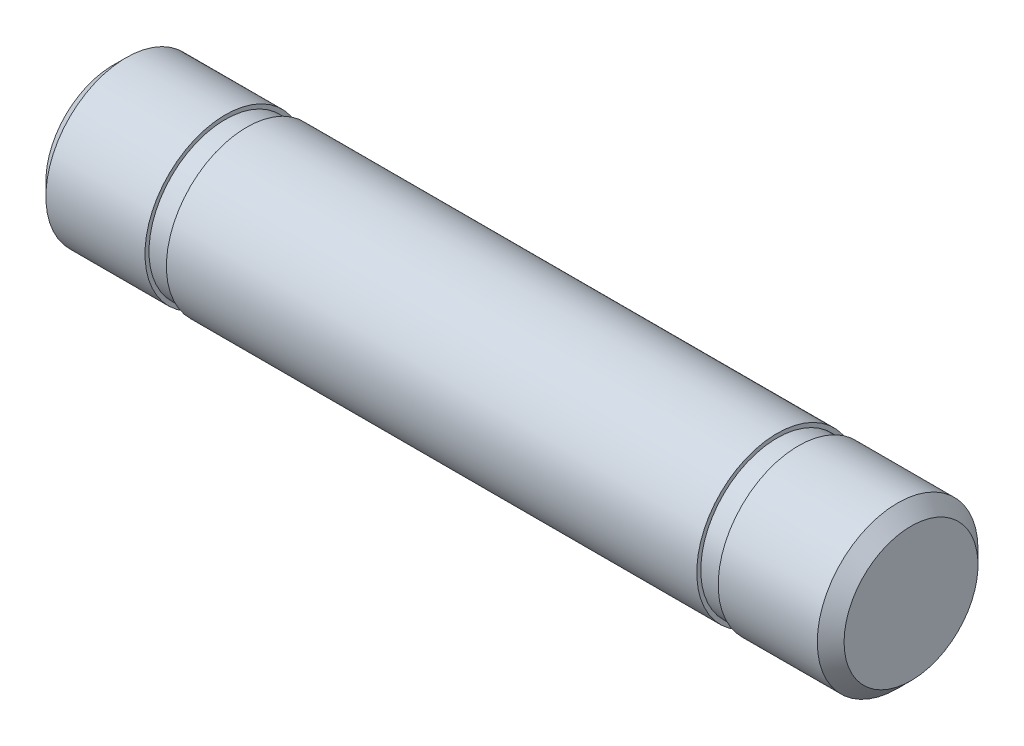
ISO-10303-21;
HEADER;
FILE_DESCRIPTION(('STEP AP214'),'2;1');
FILE_NAME('part.step','',(''),(''),'','','');
FILE_SCHEMA(('AUTOMOTIVE_DESIGN { 1 0 10303 214 1 1 1 1 }'));
ENDSEC;
DATA;
#1=APPLICATION_CONTEXT('core data for automotive mechanical design processes');
#2=APPLICATION_PROTOCOL_DEFINITION('international standard','automotive_design',2000,#1);
#3=PRODUCT_CONTEXT('',#1,'mechanical');
#4=PRODUCT('Part','Part','',(#3));
#5=PRODUCT_RELATED_PRODUCT_CATEGORY('part','',(#4));
#6=PRODUCT_DEFINITION_FORMATION('','',#4);
#7=PRODUCT_DEFINITION_CONTEXT('part definition',#1,'design');
#8=PRODUCT_DEFINITION('design','',#6,#7);
#9=PRODUCT_DEFINITION_SHAPE('','',#8);
#10=(LENGTH_UNIT() NAMED_UNIT(*) SI_UNIT(.MILLI.,.METRE.));
#11=(NAMED_UNIT(*) PLANE_ANGLE_UNIT() SI_UNIT($,.RADIAN.));
#12=(NAMED_UNIT(*) SI_UNIT($,.STERADIAN.) SOLID_ANGLE_UNIT());
#13=UNCERTAINTY_MEASURE_WITH_UNIT(LENGTH_MEASURE(1.E-05),#10,'distance_accuracy_value','');
#14=(GEOMETRIC_REPRESENTATION_CONTEXT(3) GLOBAL_UNCERTAINTY_ASSIGNED_CONTEXT((#13)) GLOBAL_UNIT_ASSIGNED_CONTEXT((#10,
#11,#12)) REPRESENTATION_CONTEXT('',''));
#15=CARTESIAN_POINT('',(0.,0.,0.));
#16=DIRECTION('',(0.,0.,1.));
#17=DIRECTION('',(1.,0.,0.));
#18=AXIS2_PLACEMENT_3D('',#15,#16,#17);
#19=CARTESIAN_POINT('',(14.9,0.,3.));
#20=DIRECTION('',(-1.,0.,0.));
#21=DIRECTION('',(0.,0.,1.));
#22=AXIS2_PLACEMENT_3D('',#19,#20,#21);
#23=PLANE('',#22);
#24=CARTESIAN_POINT('',(14.9,0.,0.));
#25=DIRECTION('',(-1.,0.,0.));
#26=DIRECTION('',(0.,0.,1.));
#27=AXIS2_PLACEMENT_3D('',#24,#25,#26);
#28=CIRCLE('',#27,2.50000000000001);
#29=CARTESIAN_POINT('',(14.9,0.,2.50000000000001));
#30=VERTEX_POINT('',#29);
#31=EDGE_CURVE('E57',#30,#30,#28,.F.);
#32=ORIENTED_EDGE('',*,*,#31,.T.);
#33=EDGE_LOOP('',(#32));
#34=FACE_BOUND('',#33,.T.);
#35=ADVANCED_FACE('F41',(#34),#23,.F.);
#36=CARTESIAN_POINT('',(14.9,0.,0.));
#37=DIRECTION('',(1.,0.,0.));
#38=DIRECTION('',(0.,0.,-1.));
#39=AXIS2_PLACEMENT_3D('',#36,#37,#38);
#40=CYLINDRICAL_SURFACE('',#39,3.);
#41=CARTESIAN_POINT('',(14.4,0.,0.));
#42=DIRECTION('',(-1.,0.,0.));
#43=DIRECTION('',(0.,0.,1.));
#44=AXIS2_PLACEMENT_3D('',#41,#42,#43);
#45=CIRCLE('',#44,3.);
#46=CARTESIAN_POINT('',(14.4,0.,3.));
#47=VERTEX_POINT('',#46);
#48=EDGE_CURVE('E53',#47,#47,#45,.T.);
#49=ORIENTED_EDGE('',*,*,#48,.T.);
#50=EDGE_LOOP('',(#49));
#51=FACE_BOUND('',#50,.T.);
#52=CARTESIAN_POINT('',(10.7,0.,0.));
#53=DIRECTION('',(1.,0.,0.));
#54=DIRECTION('',(0.,0.,-1.));
#55=AXIS2_PLACEMENT_3D('',#52,#53,#54);
#56=CIRCLE('',#55,3.);
#57=CARTESIAN_POINT('',(10.7,0.,-3.));
#58=VERTEX_POINT('',#57);
#59=EDGE_CURVE('E62',#58,#58,#56,.T.);
#60=ORIENTED_EDGE('',*,*,#59,.T.);
#61=EDGE_LOOP('',(#60));
#62=FACE_BOUND('',#61,.T.);
#63=ADVANCED_FACE('F104',(#51,#62),#40,.T.);
#64=CARTESIAN_POINT('',(10.7,0.,2.85));
#65=DIRECTION('',(1.,0.,0.));
#66=DIRECTION('',(0.,0.,-1.));
#67=AXIS2_PLACEMENT_3D('',#64,#65,#66);
#68=PLANE('',#67);
#69=ORIENTED_EDGE('',*,*,#59,.F.);
#70=EDGE_LOOP('',(#69));
#71=FACE_BOUND('',#70,.T.);
#72=CARTESIAN_POINT('',(10.7,0.,0.));
#73=DIRECTION('',(1.,0.,0.));
#74=DIRECTION('',(0.,0.,-1.));
#75=AXIS2_PLACEMENT_3D('',#72,#73,#74);
#76=CIRCLE('',#75,2.85);
#77=CARTESIAN_POINT('',(10.7,0.,-2.85));
#78=VERTEX_POINT('',#77);
#79=EDGE_CURVE('E65',#78,#78,#76,.T.);
#80=ORIENTED_EDGE('',*,*,#79,.T.);
#81=EDGE_LOOP('',(#80));
#82=FACE_BOUND('',#81,.T.);
#83=ADVANCED_FACE('F109',(#71,#82),#68,.F.);
#84=CARTESIAN_POINT('',(14.9,0.,0.));
#85=DIRECTION('',(1.,0.,0.));
#86=DIRECTION('',(0.,0.,-1.));
#87=AXIS2_PLACEMENT_3D('',#84,#85,#86);
#88=CYLINDRICAL_SURFACE('',#87,2.85);
#89=ORIENTED_EDGE('',*,*,#79,.F.);
#90=EDGE_LOOP('',(#89));
#91=FACE_BOUND('',#90,.T.);
#92=CARTESIAN_POINT('',(9.9,0.,0.));
#93=DIRECTION('',(1.,0.,0.));
#94=DIRECTION('',(0.,0.,-1.));
#95=AXIS2_PLACEMENT_3D('',#92,#93,#94);
#96=CIRCLE('',#95,2.85);
#97=CARTESIAN_POINT('',(9.9,0.,-2.85));
#98=VERTEX_POINT('',#97);
#99=EDGE_CURVE('E68',#98,#98,#96,.T.);
#100=ORIENTED_EDGE('',*,*,#99,.T.);
#101=EDGE_LOOP('',(#100));
#102=FACE_BOUND('',#101,.T.);
#103=ADVANCED_FACE('F130',(#91,#102),#88,.T.);
#104=CARTESIAN_POINT('',(9.9,0.,3.));
#105=DIRECTION('',(-1.,0.,0.));
#106=DIRECTION('',(0.,0.,1.));
#107=AXIS2_PLACEMENT_3D('',#104,#105,#106);
#108=PLANE('',#107);
#109=ORIENTED_EDGE('',*,*,#99,.F.);
#110=EDGE_LOOP('',(#109));
#111=FACE_BOUND('',#110,.T.);
#112=CARTESIAN_POINT('',(9.9,0.,0.));
#113=DIRECTION('',(1.,0.,0.));
#114=DIRECTION('',(0.,0.,-1.));
#115=AXIS2_PLACEMENT_3D('',#112,#113,#114);
#116=CIRCLE('',#115,3.);
#117=CARTESIAN_POINT('',(9.9,0.,-3.));
#118=VERTEX_POINT('',#117);
#119=EDGE_CURVE('E71',#118,#118,#116,.T.);
#120=ORIENTED_EDGE('',*,*,#119,.T.);
#121=EDGE_LOOP('',(#120));
#122=FACE_BOUND('',#121,.T.);
#123=ADVANCED_FACE('F135',(#111,#122),#108,.F.);
#124=CARTESIAN_POINT('',(14.9,0.,0.));
#125=DIRECTION('',(1.,0.,0.));
#126=DIRECTION('',(0.,0.,-1.));
#127=AXIS2_PLACEMENT_3D('',#124,#125,#126);
#128=CYLINDRICAL_SURFACE('',#127,3.);
#129=ORIENTED_EDGE('',*,*,#119,.F.);
#130=EDGE_LOOP('',(#129));
#131=FACE_BOUND('',#130,.T.);
#132=CARTESIAN_POINT('',(-9.9,0.,0.));
#133=DIRECTION('',(1.,0.,0.));
#134=DIRECTION('',(0.,0.,-1.));
#135=AXIS2_PLACEMENT_3D('',#132,#133,#134);
#136=CIRCLE('',#135,3.);
#137=CARTESIAN_POINT('',(-9.9,0.,-3.));
#138=VERTEX_POINT('',#137);
#139=EDGE_CURVE('E74',#138,#138,#136,.T.);
#140=ORIENTED_EDGE('',*,*,#139,.T.);
#141=EDGE_LOOP('',(#140));
#142=FACE_BOUND('',#141,.T.);
#143=ADVANCED_FACE('F141',(#131,#142),#128,.T.);
#144=CARTESIAN_POINT('',(-9.9,0.,3.));
#145=DIRECTION('',(1.,0.,0.));
#146=DIRECTION('',(0.,0.,-1.));
#147=AXIS2_PLACEMENT_3D('',#144,#145,#146);
#148=PLANE('',#147);
#149=ORIENTED_EDGE('',*,*,#139,.F.);
#150=EDGE_LOOP('',(#149));
#151=FACE_BOUND('',#150,.T.);
#152=CARTESIAN_POINT('',(-9.9,0.,0.));
#153=DIRECTION('',(1.,0.,0.));
#154=DIRECTION('',(0.,0.,-1.));
#155=AXIS2_PLACEMENT_3D('',#152,#153,#154);
#156=CIRCLE('',#155,2.85);
#157=CARTESIAN_POINT('',(-9.9,0.,-2.85));
#158=VERTEX_POINT('',#157);
#159=EDGE_CURVE('E77',#158,#158,#156,.T.);
#160=ORIENTED_EDGE('',*,*,#159,.T.);
#161=EDGE_LOOP('',(#160));
#162=FACE_BOUND('',#161,.T.);
#163=ADVANCED_FACE('F147',(#151,#162),#148,.F.);
#164=CARTESIAN_POINT('',(14.9,0.,0.));
#165=DIRECTION('',(1.,0.,0.));
#166=DIRECTION('',(0.,0.,-1.));
#167=AXIS2_PLACEMENT_3D('',#164,#165,#166);
#168=CYLINDRICAL_SURFACE('',#167,2.85);
#169=ORIENTED_EDGE('',*,*,#159,.F.);
#170=EDGE_LOOP('',(#169));
#171=FACE_BOUND('',#170,.T.);
#172=CARTESIAN_POINT('',(-10.7,0.,0.));
#173=DIRECTION('',(1.,0.,0.));
#174=DIRECTION('',(0.,0.,-1.));
#175=AXIS2_PLACEMENT_3D('',#172,#173,#174);
#176=CIRCLE('',#175,2.85);
#177=CARTESIAN_POINT('',(-10.7,0.,-2.85));
#178=VERTEX_POINT('',#177);
#179=EDGE_CURVE('E80',#178,#178,#176,.T.);
#180=ORIENTED_EDGE('',*,*,#179,.T.);
#181=EDGE_LOOP('',(#180));
#182=FACE_BOUND('',#181,.T.);
#183=ADVANCED_FACE('F100',(#171,#182),#168,.T.);
#184=CARTESIAN_POINT('',(-10.7,0.,2.85));
#185=DIRECTION('',(-1.,0.,0.));
#186=DIRECTION('',(0.,0.,1.));
#187=AXIS2_PLACEMENT_3D('',#184,#185,#186);
#188=PLANE('',#187);
#189=ORIENTED_EDGE('',*,*,#179,.F.);
#190=EDGE_LOOP('',(#189));
#191=FACE_BOUND('',#190,.T.);
#192=CARTESIAN_POINT('',(-10.7,0.,0.));
#193=DIRECTION('',(1.,0.,0.));
#194=DIRECTION('',(0.,0.,-1.));
#195=AXIS2_PLACEMENT_3D('',#192,#193,#194);
#196=CIRCLE('',#195,3.);
#197=CARTESIAN_POINT('',(-10.7,0.,-3.));
#198=VERTEX_POINT('',#197);
#199=EDGE_CURVE('E83',#198,#198,#196,.T.);
#200=ORIENTED_EDGE('',*,*,#199,.T.);
#201=EDGE_LOOP('',(#200));
#202=FACE_BOUND('',#201,.T.);
#203=ADVANCED_FACE('F87',(#191,#202),#188,.F.);
#204=CARTESIAN_POINT('',(14.9,0.,0.));
#205=DIRECTION('',(1.,0.,0.));
#206=DIRECTION('',(0.,0.,-1.));
#207=AXIS2_PLACEMENT_3D('',#204,#205,#206);
#208=CYLINDRICAL_SURFACE('',#207,3.);
#209=CARTESIAN_POINT('',(-14.4,0.,0.));
#210=DIRECTION('',(1.,0.,0.));
#211=DIRECTION('',(0.,0.,-1.));
#212=AXIS2_PLACEMENT_3D('',#209,#210,#211);
#213=CIRCLE('',#212,3.);
#214=CARTESIAN_POINT('',(-14.4,0.,-3.));
#215=VERTEX_POINT('',#214);
#216=EDGE_CURVE('E49',#215,#215,#213,.T.);
#217=ORIENTED_EDGE('',*,*,#216,.T.);
#218=EDGE_LOOP('',(#217));
#219=FACE_BOUND('',#218,.T.);
#220=ORIENTED_EDGE('',*,*,#199,.F.);
#221=EDGE_LOOP('',(#220));
#222=FACE_BOUND('',#221,.T.);
#223=ADVANCED_FACE('F89',(#219,#222),#208,.T.);
#224=CARTESIAN_POINT('',(-14.9,0.,3.));
#225=DIRECTION('',(1.,0.,0.));
#226=DIRECTION('',(0.,0.,-1.));
#227=AXIS2_PLACEMENT_3D('',#224,#225,#226);
#228=PLANE('',#227);
#229=CARTESIAN_POINT('',(-14.9,0.,0.));
#230=DIRECTION('',(1.,0.,0.));
#231=DIRECTION('',(0.,0.,-1.));
#232=AXIS2_PLACEMENT_3D('',#229,#230,#231);
#233=CIRCLE('',#232,2.5);
#234=CARTESIAN_POINT('',(-14.9,0.,-2.5));
#235=VERTEX_POINT('',#234);
#236=EDGE_CURVE('E10',#235,#235,#233,.F.);
#237=ORIENTED_EDGE('',*,*,#236,.T.);
#238=EDGE_LOOP('',(#237));
#239=FACE_BOUND('',#238,.T.);
#240=ADVANCED_FACE('F91',(#239),#228,.F.);
#241=CARTESIAN_POINT('',(14.9,0.,0.));
#242=DIRECTION('',(-1.,0.,0.));
#243=DIRECTION('',(0.,0.,1.));
#244=AXIS2_PLACEMENT_3D('',#241,#242,#243);
#245=CONICAL_SURFACE('',#244,2.50000000000001,0.785398163397441);
#246=ORIENTED_EDGE('',*,*,#48,.F.);
#247=EDGE_LOOP('',(#246));
#248=FACE_BOUND('',#247,.T.);
#249=ORIENTED_EDGE('',*,*,#31,.F.);
#250=EDGE_LOOP('',(#249));
#251=FACE_BOUND('',#250,.T.);
#252=ADVANCED_FACE('F97',(#248,#251),#245,.T.);
#253=CARTESIAN_POINT('',(-14.4,0.,0.));
#254=DIRECTION('',(1.,0.,0.));
#255=DIRECTION('',(0.,0.,-1.));
#256=AXIS2_PLACEMENT_3D('',#253,#254,#255);
#257=CONICAL_SURFACE('',#256,3.,0.785398163397446);
#258=ORIENTED_EDGE('',*,*,#236,.F.);
#259=EDGE_LOOP('',(#258));
#260=FACE_BOUND('',#259,.T.);
#261=ORIENTED_EDGE('',*,*,#216,.F.);
#262=EDGE_LOOP('',(#261));
#263=FACE_BOUND('',#262,.T.);
#264=ADVANCED_FACE('F44',(#260,#263),#257,.T.);
#265=CLOSED_SHELL('',(#35,#63,#83,#103,#123,#143,#163,#183,#203,#223,#240,#252,#264));
#266=MANIFOLD_SOLID_BREP('B2',#265);
#267=ADVANCED_BREP_SHAPE_REPRESENTATION('',(#18,#266),#14);
#268=SHAPE_DEFINITION_REPRESENTATION(#9,#267);
ENDSEC;
END-ISO-10303-21;
